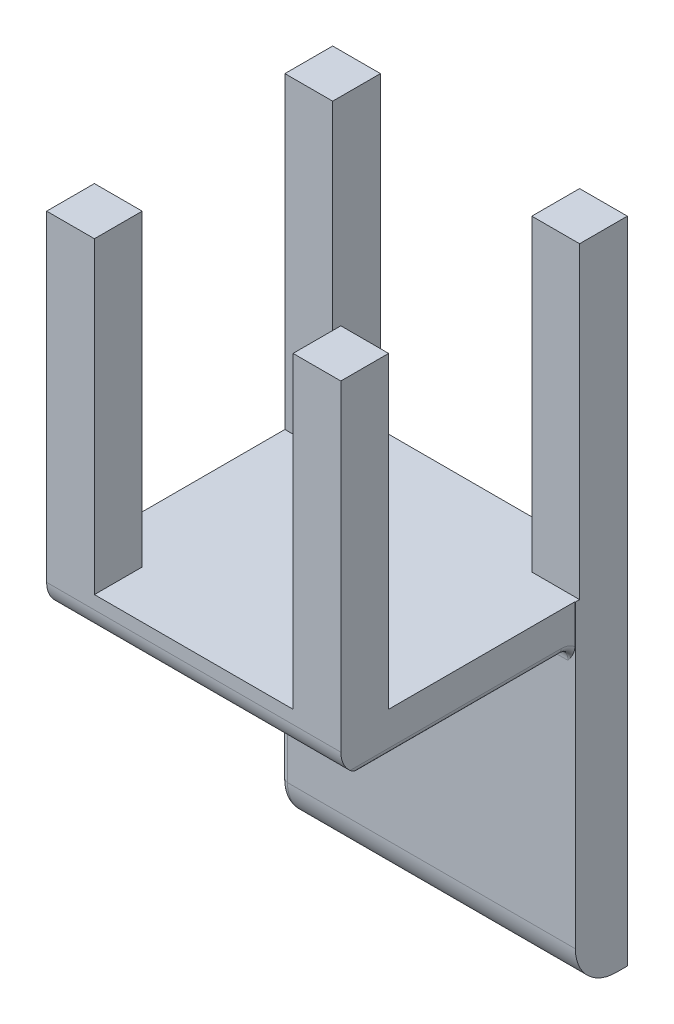
ISO-10303-21;
HEADER;
FILE_DESCRIPTION(('STEP AP214'),'2;1');
FILE_NAME('part.step','',(''),(''),'','','');
FILE_SCHEMA(('AUTOMOTIVE_DESIGN { 1 0 10303 214 1 1 1 1 }'));
ENDSEC;
DATA;
#1=APPLICATION_CONTEXT('core data for automotive mechanical design processes');
#2=APPLICATION_PROTOCOL_DEFINITION('international standard','automotive_design',2000,#1);
#3=PRODUCT_CONTEXT('',#1,'mechanical');
#4=PRODUCT('Part','Part','',(#3));
#5=PRODUCT_RELATED_PRODUCT_CATEGORY('part','',(#4));
#6=PRODUCT_DEFINITION_FORMATION('','',#4);
#7=PRODUCT_DEFINITION_CONTEXT('part definition',#1,'design');
#8=PRODUCT_DEFINITION('design','',#6,#7);
#9=PRODUCT_DEFINITION_SHAPE('','',#8);
#10=(LENGTH_UNIT() NAMED_UNIT(*) SI_UNIT(.MILLI.,.METRE.));
#11=(NAMED_UNIT(*) PLANE_ANGLE_UNIT() SI_UNIT($,.RADIAN.));
#12=(NAMED_UNIT(*) SI_UNIT($,.STERADIAN.) SOLID_ANGLE_UNIT());
#13=UNCERTAINTY_MEASURE_WITH_UNIT(LENGTH_MEASURE(1.E-05),#10,'distance_accuracy_value','');
#14=(GEOMETRIC_REPRESENTATION_CONTEXT(3) GLOBAL_UNCERTAINTY_ASSIGNED_CONTEXT((#13)) GLOBAL_UNIT_ASSIGNED_CONTEXT((#10,
#11,#12)) REPRESENTATION_CONTEXT('',''));
#15=CARTESIAN_POINT('',(0.,0.,0.));
#16=DIRECTION('',(0.,0.,1.));
#17=DIRECTION('',(1.,0.,0.));
#18=AXIS2_PLACEMENT_3D('',#15,#16,#17);
#19=CARTESIAN_POINT('',(-36.936387434555,59.4273560209424,-76.2));
#20=DIRECTION('',(0.,1.,0.));
#21=DIRECTION('',(0.,0.,1.));
#22=AXIS2_PLACEMENT_3D('',#19,#20,#21);
#23=PLANE('',#22);
#24=DIRECTION('',(0.,0.,-1.));
#25=VECTOR('',#24,1.);
#26=CARTESIAN_POINT('',(33.063612565445,59.4273560209424,-76.2));
#27=LINE('',#26,#25);
#28=CARTESIAN_POINT('',(33.063612565445,59.4273560209424,-6.20000000000001));
#29=VERTEX_POINT('',#28);
#30=CARTESIAN_POINT('',(33.063612565445,59.4273560209424,-76.2));
#31=VERTEX_POINT('',#30);
#32=EDGE_CURVE('E255',#29,#31,#27,.T.);
#33=ORIENTED_EDGE('',*,*,#32,.F.);
#34=DIRECTION('',(1.,0.,0.));
#35=VECTOR('',#34,1.);
#36=CARTESIAN_POINT('',(-36.936387434555,59.4273560209424,-6.2));
#37=LINE('',#36,#35);
#38=CARTESIAN_POINT('',(-36.936387434555,59.4273560209424,-6.20000000000003));
#39=VERTEX_POINT('',#38);
#40=EDGE_CURVE('E514',#39,#29,#37,.T.);
#41=ORIENTED_EDGE('',*,*,#40,.F.);
#42=DIRECTION('',(0.,0.,1.));
#43=VECTOR('',#42,1.);
#44=CARTESIAN_POINT('',(-36.936387434555,59.4273560209424,-76.2));
#45=LINE('',#44,#43);
#46=CARTESIAN_POINT('',(-36.936387434555,59.4273560209424,272.9));
#47=VERTEX_POINT('',#46);
#48=EDGE_CURVE('E260',#39,#47,#45,.T.);
#49=ORIENTED_EDGE('',*,*,#48,.T.);
#50=DIRECTION('',(-1.,0.,0.));
#51=VECTOR('',#50,1.);
#52=CARTESIAN_POINT('',(-36.9363874345549,59.4273560209424,272.9));
#53=LINE('',#52,#51);
#54=CARTESIAN_POINT('',(33.0636125654451,59.4273560209424,272.9));
#55=VERTEX_POINT('',#54);
#56=EDGE_CURVE('E320',#55,#47,#53,.T.);
#57=ORIENTED_EDGE('',*,*,#56,.F.);
#58=DIRECTION('',(0.,0.,-1.));
#59=VECTOR('',#58,1.);
#60=CARTESIAN_POINT('',(33.0636125654451,59.4273560209424,342.9));
#61=LINE('',#60,#59);
#62=CARTESIAN_POINT('',(33.0636125654451,59.4273560209424,342.9));
#63=VERTEX_POINT('',#62);
#64=EDGE_CURVE('E315',#63,#55,#61,.T.);
#65=ORIENTED_EDGE('',*,*,#64,.F.);
#66=DIRECTION('',(1.,0.,0.));
#67=VECTOR('',#66,1.);
#68=CARTESIAN_POINT('',(-36.9363874345549,59.4273560209424,342.9));
#69=LINE('',#68,#67);
#70=CARTESIAN_POINT('',(324.12168816682,59.4273560209424,342.9));
#71=VERTEX_POINT('',#70);
#72=EDGE_CURVE('E340',#63,#71,#69,.T.);
#73=ORIENTED_EDGE('',*,*,#72,.T.);
#74=DIRECTION('',(0.,0.,1.));
#75=VECTOR('',#74,1.);
#76=CARTESIAN_POINT('',(324.12168816682,59.4273560209424,342.9));
#77=LINE('',#76,#75);
#78=CARTESIAN_POINT('',(324.12168816682,59.4273560209424,272.9));
#79=VERTEX_POINT('',#78);
#80=EDGE_CURVE('E295',#79,#71,#77,.T.);
#81=ORIENTED_EDGE('',*,*,#80,.F.);
#82=DIRECTION('',(-1.,0.,0.));
#83=VECTOR('',#82,1.);
#84=CARTESIAN_POINT('',(394.12168816682,59.4273560209424,272.9));
#85=LINE('',#84,#83);
#86=CARTESIAN_POINT('',(394.12168816682,59.4273560209424,272.9));
#87=VERTEX_POINT('',#86);
#88=EDGE_CURVE('E290',#87,#79,#85,.T.);
#89=ORIENTED_EDGE('',*,*,#88,.F.);
#90=DIRECTION('',(0.,0.,-1.));
#91=VECTOR('',#90,1.);
#92=CARTESIAN_POINT('',(394.12168816682,59.4273560209424,-76.2));
#93=LINE('',#92,#91);
#94=CARTESIAN_POINT('',(394.12168816682,59.4273560209424,0.));
#95=VERTEX_POINT('',#94);
#96=EDGE_CURVE('E338',#87,#95,#93,.T.);
#97=ORIENTED_EDGE('',*,*,#96,.T.);
#98=DIRECTION('',(-1.,0.,0.));
#99=VECTOR('',#98,1.);
#100=CARTESIAN_POINT('',(-36.936387434555,59.4273560209424,0.));
#101=LINE('',#100,#99);
#102=CARTESIAN_POINT('',(394.863612565445,59.4273560209424,0.));
#103=VERTEX_POINT('',#102);
#104=EDGE_CURVE('E352',#103,#95,#101,.T.);
#105=ORIENTED_EDGE('',*,*,#104,.F.);
#106=DIRECTION('',(0.,0.,1.));
#107=VECTOR('',#106,1.);
#108=CARTESIAN_POINT('',(394.863612565445,59.4273560209424,-76.2));
#109=LINE('',#108,#107);
#110=CARTESIAN_POINT('',(394.863612565445,59.4273560209424,-6.20000000000003));
#111=VERTEX_POINT('',#110);
#112=EDGE_CURVE('E364',#111,#103,#109,.T.);
#113=ORIENTED_EDGE('',*,*,#112,.F.);
#114=DIRECTION('',(1.,0.,0.));
#115=VECTOR('',#114,1.);
#116=CARTESIAN_POINT('',(394.863612565445,59.4273560209424,-6.2));
#117=LINE('',#116,#115);
#118=CARTESIAN_POINT('',(324.863612565445,59.4273560209424,-6.2));
#119=VERTEX_POINT('',#118);
#120=EDGE_CURVE('E264',#119,#111,#117,.T.);
#121=ORIENTED_EDGE('',*,*,#120,.F.);
#122=DIRECTION('',(0.,0.,1.));
#123=VECTOR('',#122,1.);
#124=CARTESIAN_POINT('',(324.863612565445,59.4273560209424,-76.2));
#125=LINE('',#124,#123);
#126=CARTESIAN_POINT('',(324.863612565445,59.4273560209424,-76.2));
#127=VERTEX_POINT('',#126);
#128=EDGE_CURVE('E261',#127,#119,#125,.T.);
#129=ORIENTED_EDGE('',*,*,#128,.F.);
#130=DIRECTION('',(-1.,0.,0.));
#131=VECTOR('',#130,1.);
#132=CARTESIAN_POINT('',(-36.936387434555,59.4273560209424,-76.2));
#133=LINE('',#132,#131);
#134=EDGE_CURVE('E356',#127,#31,#133,.T.);
#135=ORIENTED_EDGE('',*,*,#134,.T.);
#136=EDGE_LOOP('',(#33,#41,#49,#57,#65,#73,#81,#89,#97,#105,#113,#121,#129,#135));
#137=FACE_BOUND('',#136,.T.);
#138=ADVANCED_FACE('F58',(#137),#23,.T.);
#139=CARTESIAN_POINT('',(-36.9363874345549,-440.572643979058,0.));
#140=DIRECTION('',(0.,0.,1.));
#141=DIRECTION('',(1.,0.,0.));
#142=AXIS2_PLACEMENT_3D('',#139,#140,#141);
#143=PLANE('',#142);
#144=DIRECTION('',(-1.,0.,0.));
#145=VECTOR('',#144,1.);
#146=CARTESIAN_POINT('',(-36.9363874345549,-20.,0.));
#147=LINE('',#146,#145);
#148=CARTESIAN_POINT('',(384.12168816682,-20.,0.));
#149=VERTEX_POINT('',#148);
#150=CARTESIAN_POINT('',(-26.936387434555,-20.,0.));
#151=VERTEX_POINT('',#150);
#152=EDGE_CURVE('E378',#149,#151,#147,.T.);
#153=ORIENTED_EDGE('',*,*,#152,.T.);
#154=DIRECTION('',(0.,-1.,0.));
#155=VECTOR('',#154,1.);
#156=CARTESIAN_POINT('',(-26.9363874345549,-440.572643979058,0.));
#157=LINE('',#156,#155);
#158=CARTESIAN_POINT('',(-26.9363874345549,-380.572643979058,0.));
#159=VERTEX_POINT('',#158);
#160=EDGE_CURVE('E459',#151,#159,#157,.T.);
#161=ORIENTED_EDGE('',*,*,#160,.T.);
#162=DIRECTION('',(1.,0.,0.));
#163=VECTOR('',#162,1.);
#164=CARTESIAN_POINT('',(-36.9363874345549,-380.572643979058,0.));
#165=LINE('',#164,#163);
#166=CARTESIAN_POINT('',(394.863612565445,-380.572643979058,0.));
#167=VERTEX_POINT('',#166);
#168=EDGE_CURVE('E371',#159,#167,#165,.T.);
#169=ORIENTED_EDGE('',*,*,#168,.T.);
#170=DIRECTION('',(0.,1.,0.));
#171=VECTOR('',#170,1.);
#172=CARTESIAN_POINT('',(394.863612565445,59.4273560209424,0.));
#173=LINE('',#172,#171);
#174=EDGE_CURVE('E348',#167,#103,#173,.T.);
#175=ORIENTED_EDGE('',*,*,#174,.T.);
#176=ORIENTED_EDGE('',*,*,#104,.T.);
#177=DIRECTION('',(0.,-1.,0.));
#178=VECTOR('',#177,1.);
#179=CARTESIAN_POINT('',(394.12168816682,-440.572643979058,0.));
#180=LINE('',#179,#178);
#181=CARTESIAN_POINT('',(394.12168816682,2.36067977499788,0.));
#182=VERTEX_POINT('',#181);
#183=EDGE_CURVE('E363',#95,#182,#180,.T.);
#184=ORIENTED_EDGE('',*,*,#183,.T.);
#185=CARTESIAN_POINT('',(394.12168816682,2.36067977499787,0.));
#186=CARTESIAN_POINT('',(394.121655533778,1.7668018034508,0.));
#187=CARTESIAN_POINT('',(394.092316176492,1.17350545199401,0.));
#188=CARTESIAN_POINT('',(393.981244959188,-0.00705360978580998,0.));
#189=CARTESIAN_POINT('',(393.899617732876,-0.594325995462053,0.));
#190=CARTESIAN_POINT('',(393.691865961787,-1.75077305326588,0.));
#191=CARTESIAN_POINT('',(393.566495634174,-2.32008651156857,0.));
#192=CARTESIAN_POINT('',(393.276405153814,-3.4487804276718,0.));
#193=CARTESIAN_POINT('',(393.111662985589,-4.00815513936166,0.));
#194=CARTESIAN_POINT('',(392.531699563841,-5.77388771393059,0.));
#195=CARTESIAN_POINT('',(392.051462169276,-6.95917298785604,0.));
#196=CARTESIAN_POINT('',(391.243384451654,-8.69510351090225,0.));
#197=CARTESIAN_POINT('',(390.9591135233,-9.26723662406322,0.));
#198=CARTESIAN_POINT('',(390.366142403757,-10.3987394378843,0.));
#199=CARTESIAN_POINT('',(390.057444523513,-10.9581103394957,0.));
#200=CARTESIAN_POINT('',(389.09608206183,-12.6288832158288,0.));
#201=CARTESIAN_POINT('',(388.413095174206,-13.7227184872839,0.));
#202=CARTESIAN_POINT('',(387.000753715579,-15.8784951602481,0.));
#203=CARTESIAN_POINT('',(386.271420170998,-16.9404507074046,0.));
#204=CARTESIAN_POINT('',(385.070518799888,-18.6580603080427,0.));
#205=CARTESIAN_POINT('',(384.604290340854,-19.3174964157779,0.));
#206=CARTESIAN_POINT('',(384.132574788428,-19.9846039925884,0.));
#207=CARTESIAN_POINT('',(384.127131477892,-19.9923019961752,0.));
#208=CARTESIAN_POINT('',(384.12168816682,-20.,0.));
#209=B_SPLINE_CURVE_WITH_KNOTS('',3,(#185,#186,#187,#188,#189,#190,#191,#192,#193,#194,#195,
#196,#197,#198,#199,#200,#201,#202,#203,#204,#205,#206,#207,#208),.UNSPECIFIED.,.F.,.F.,(4,2,2,
2,2,2,2,2,2,2,2,4),(0.,1.78007201554753,3.5565929945062,5.3038846405867,7.05215561193782,
10.8779322078743,12.7942256891127,14.7103380930115,18.5765462026267,22.4410126539084,
24.8638369819083,24.8921212531558),.UNSPECIFIED.);
#210=EDGE_CURVE('E393',#182,#149,#209,.T.);
#211=ORIENTED_EDGE('',*,*,#210,.T.);
#212=EDGE_LOOP('',(#153,#161,#169,#175,#176,#184,#211));
#213=FACE_BOUND('',#212,.T.);
#214=ADVANCED_FACE('F408',(#213),#143,.T.);
#215=CARTESIAN_POINT('',(-36.936387434555,59.4273560209424,-76.2));
#216=DIRECTION('',(-1.,0.,0.));
#217=DIRECTION('',(0.,-1.,0.));
#218=AXIS2_PLACEMENT_3D('',#215,#216,#217);
#219=PLANE('',#218);
#220=DIRECTION('',(0.,0.,1.));
#221=VECTOR('',#220,1.);
#222=CARTESIAN_POINT('',(-36.936387434555,9.99999999999999,342.9));
#223=LINE('',#222,#221);
#224=CARTESIAN_POINT('',(-36.936387434555,9.99999999999999,20.));
#225=VERTEX_POINT('',#224);
#226=CARTESIAN_POINT('',(-36.936387434555,10.,329.357513110646));
#227=VERTEX_POINT('',#226);
#228=EDGE_CURVE('E401',#225,#227,#223,.T.);
#229=ORIENTED_EDGE('',*,*,#228,.T.);
#230=CARTESIAN_POINT('',(-36.936387434555,40.,302.9));
#231=DIRECTION('',(-1.,0.,0.));
#232=DIRECTION('',(0.,-1.,0.));
#233=AXIS2_PLACEMENT_3D('',#230,#231,#232);
#234=CIRCLE('',#233,40.);
#235=CARTESIAN_POINT('',(-36.9363874345549,40.,342.9));
#236=VERTEX_POINT('',#235);
#237=EDGE_CURVE('E12',#227,#236,#234,.T.);
#238=ORIENTED_EDGE('',*,*,#237,.T.);
#239=DIRECTION('',(0.,-1.,0.));
#240=VECTOR('',#239,1.);
#241=CARTESIAN_POINT('',(-36.9363874345549,59.4273560209424,342.9));
#242=LINE('',#241,#240);
#243=CARTESIAN_POINT('',(-36.9363874345549,511.027356020943,342.9));
#244=VERTEX_POINT('',#243);
#245=EDGE_CURVE('E345',#244,#236,#242,.T.);
#246=ORIENTED_EDGE('',*,*,#245,.F.);
#247=DIRECTION('',(0.,0.,1.));
#248=VECTOR('',#247,1.);
#249=CARTESIAN_POINT('',(-36.9363874345549,511.027356020943,342.9));
#250=LINE('',#249,#248);
#251=CARTESIAN_POINT('',(-36.9363874345549,511.027356020943,272.9));
#252=VERTEX_POINT('',#251);
#253=EDGE_CURVE('E316',#252,#244,#250,.T.);
#254=ORIENTED_EDGE('',*,*,#253,.F.);
#255=DIRECTION('',(0.,-1.,0.));
#256=VECTOR('',#255,1.);
#257=CARTESIAN_POINT('',(-36.9363874345549,511.027356020943,272.9));
#258=LINE('',#257,#256);
#259=EDGE_CURVE('E326',#252,#47,#258,.T.);
#260=ORIENTED_EDGE('',*,*,#259,.T.);
#261=ORIENTED_EDGE('',*,*,#48,.F.);
#262=DIRECTION('',(0.,-1.,0.));
#263=VECTOR('',#262,1.);
#264=CARTESIAN_POINT('',(-36.936387434555,511.027356020943,-6.2));
#265=LINE('',#264,#263);
#266=CARTESIAN_POINT('',(-36.936387434555,511.027356020943,-6.2));
#267=VERTEX_POINT('',#266);
#268=EDGE_CURVE('E240',#267,#39,#265,.T.);
#269=ORIENTED_EDGE('',*,*,#268,.F.);
#270=DIRECTION('',(0.,0.,1.));
#271=VECTOR('',#270,1.);
#272=CARTESIAN_POINT('',(-36.936387434555,511.027356020943,-76.2));
#273=LINE('',#272,#271);
#274=CARTESIAN_POINT('',(-36.936387434555,511.027356020943,-76.2));
#275=VERTEX_POINT('',#274);
#276=EDGE_CURVE('E246',#275,#267,#273,.T.);
#277=ORIENTED_EDGE('',*,*,#276,.F.);
#278=DIRECTION('',(0.,-1.,0.));
#279=VECTOR('',#278,1.);
#280=CARTESIAN_POINT('',(-36.936387434555,59.4273560209424,-76.2));
#281=LINE('',#280,#279);
#282=CARTESIAN_POINT('',(-36.9363874345549,-430.572643979058,-76.2));
#283=VERTEX_POINT('',#282);
#284=EDGE_CURVE('E349',#275,#283,#281,.T.);
#285=ORIENTED_EDGE('',*,*,#284,.T.);
#286=DIRECTION('',(0.,0.,1.));
#287=VECTOR('',#286,1.);
#288=CARTESIAN_POINT('',(-36.9363874345549,-430.572643979058,-76.2));
#289=LINE('',#288,#287);
#290=CARTESIAN_POINT('',(-36.9363874345549,-430.572643979058,-60.));
#291=VERTEX_POINT('',#290);
#292=EDGE_CURVE('E530',#283,#291,#289,.T.);
#293=ORIENTED_EDGE('',*,*,#292,.T.);
#294=CARTESIAN_POINT('',(-36.9363874345549,-380.572643979058,-60.));
#295=DIRECTION('',(-1.,0.,0.));
#296=DIRECTION('',(0.,-1.,0.));
#297=AXIS2_PLACEMENT_3D('',#294,#295,#296);
#298=CIRCLE('',#297,50.);
#299=CARTESIAN_POINT('',(-36.9363874345549,-380.572643979058,-10.));
#300=VERTEX_POINT('',#299);
#301=EDGE_CURVE('E535',#291,#300,#298,.T.);
#302=ORIENTED_EDGE('',*,*,#301,.T.);
#303=DIRECTION('',(0.,-1.,0.));
#304=VECTOR('',#303,1.);
#305=CARTESIAN_POINT('',(-36.936387434555,59.4273560209424,-9.99999999999999));
#306=LINE('',#305,#304);
#307=CARTESIAN_POINT('',(-36.936387434555,-20.,-10.));
#308=VERTEX_POINT('',#307);
#309=EDGE_CURVE('E538',#300,#308,#306,.F.);
#310=ORIENTED_EDGE('',*,*,#309,.T.);
#311=CARTESIAN_POINT('',(-36.936387434555,-20.,20.));
#312=DIRECTION('',(-1.,0.,0.));
#313=DIRECTION('',(0.,-1.,0.));
#314=AXIS2_PLACEMENT_3D('',#311,#312,#313);
#315=CIRCLE('',#314,30.);
#316=EDGE_CURVE('E549',#308,#225,#315,.F.);
#317=ORIENTED_EDGE('',*,*,#316,.T.);
#318=EDGE_LOOP('',(#229,#238,#246,#254,#260,#261,#269,#277,#285,#293,#302,#310,#317));
#319=FACE_BOUND('',#318,.T.);
#320=ADVANCED_FACE('F258',(#319),#219,.T.);
#321=CARTESIAN_POINT('',(394.863612565445,59.4273560209424,-76.2));
#322=DIRECTION('',(1.,0.,0.));
#323=DIRECTION('',(0.,1.,0.));
#324=AXIS2_PLACEMENT_3D('',#321,#322,#323);
#325=PLANE('',#324);
#326=ORIENTED_EDGE('',*,*,#174,.F.);
#327=CARTESIAN_POINT('',(394.863612565445,-380.572643979058,-60.));
#328=DIRECTION('',(1.,0.,0.));
#329=DIRECTION('',(0.,1.,0.));
#330=AXIS2_PLACEMENT_3D('',#327,#328,#329);
#331=CIRCLE('',#330,60.);
#332=CARTESIAN_POINT('',(394.863612565445,-440.572643979058,-60.));
#333=VERTEX_POINT('',#332);
#334=EDGE_CURVE('E373',#167,#333,#331,.T.);
#335=ORIENTED_EDGE('',*,*,#334,.T.);
#336=DIRECTION('',(0.,0.,1.));
#337=VECTOR('',#336,1.);
#338=CARTESIAN_POINT('',(394.863612565445,-440.572643979058,-76.2));
#339=LINE('',#338,#337);
#340=CARTESIAN_POINT('',(394.863612565445,-440.572643979058,-76.2));
#341=VERTEX_POINT('',#340);
#342=EDGE_CURVE('E358',#341,#333,#339,.T.);
#343=ORIENTED_EDGE('',*,*,#342,.F.);
#344=DIRECTION('',(0.,1.,0.));
#345=VECTOR('',#344,1.);
#346=CARTESIAN_POINT('',(394.863612565445,59.4273560209424,-76.2));
#347=LINE('',#346,#345);
#348=CARTESIAN_POINT('',(394.863612565445,511.027356020943,-76.2));
#349=VERTEX_POINT('',#348);
#350=EDGE_CURVE('E354',#341,#349,#347,.T.);
#351=ORIENTED_EDGE('',*,*,#350,.T.);
#352=DIRECTION('',(0.,0.,-1.));
#353=VECTOR('',#352,1.);
#354=CARTESIAN_POINT('',(394.863612565445,511.027356020943,-76.2));
#355=LINE('',#354,#353);
#356=CARTESIAN_POINT('',(394.863612565445,511.027356020943,-6.2));
#357=VERTEX_POINT('',#356);
#358=EDGE_CURVE('E270',#357,#349,#355,.T.);
#359=ORIENTED_EDGE('',*,*,#358,.F.);
#360=DIRECTION('',(0.,-1.,0.));
#361=VECTOR('',#360,1.);
#362=CARTESIAN_POINT('',(394.863612565445,511.027356020943,-6.2));
#363=LINE('',#362,#361);
#364=EDGE_CURVE('E278',#357,#111,#363,.T.);
#365=ORIENTED_EDGE('',*,*,#364,.T.);
#366=ORIENTED_EDGE('',*,*,#112,.T.);
#367=EDGE_LOOP('',(#326,#335,#343,#351,#359,#365,#366));
#368=FACE_BOUND('',#367,.T.);
#369=ADVANCED_FACE('F419',(#368),#325,.T.);
#370=CARTESIAN_POINT('',(-36.9363874345549,-440.572643979058,-76.2));
#371=DIRECTION('',(0.,-1.,0.));
#372=DIRECTION('',(0.,0.,-1.));
#373=AXIS2_PLACEMENT_3D('',#370,#371,#372);
#374=PLANE('',#373);
#375=DIRECTION('',(1.,0.,0.));
#376=VECTOR('',#375,1.);
#377=CARTESIAN_POINT('',(-36.9363874345549,-440.572643979058,-60.));
#378=LINE('',#377,#376);
#379=CARTESIAN_POINT('',(-26.9363874345549,-440.572643979058,-60.));
#380=VERTEX_POINT('',#379);
#381=EDGE_CURVE('E375',#333,#380,#378,.F.);
#382=ORIENTED_EDGE('',*,*,#381,.T.);
#383=DIRECTION('',(0.,0.,1.));
#384=VECTOR('',#383,1.);
#385=CARTESIAN_POINT('',(-26.9363874345549,-440.572643979058,-76.2));
#386=LINE('',#385,#384);
#387=CARTESIAN_POINT('',(-26.9363874345549,-440.572643979058,-76.2));
#388=VERTEX_POINT('',#387);
#389=EDGE_CURVE('E534',#380,#388,#386,.F.);
#390=ORIENTED_EDGE('',*,*,#389,.T.);
#391=DIRECTION('',(1.,0.,0.));
#392=VECTOR('',#391,1.);
#393=CARTESIAN_POINT('',(-36.9363874345549,-440.572643979058,-76.2));
#394=LINE('',#393,#392);
#395=EDGE_CURVE('E351',#388,#341,#394,.T.);
#396=ORIENTED_EDGE('',*,*,#395,.T.);
#397=ORIENTED_EDGE('',*,*,#342,.T.);
#398=EDGE_LOOP('',(#382,#390,#396,#397));
#399=FACE_BOUND('',#398,.T.);
#400=ADVANCED_FACE('F422',(#399),#374,.T.);
#401=CARTESIAN_POINT('',(-36.9363874345549,-440.572643979058,-76.2));
#402=DIRECTION('',(0.,0.,1.));
#403=DIRECTION('',(1.,0.,0.));
#404=AXIS2_PLACEMENT_3D('',#401,#402,#403);
#405=PLANE('',#404);
#406=ORIENTED_EDGE('',*,*,#395,.F.);
#407=CARTESIAN_POINT('',(-26.9363874345549,-430.572643979058,-76.2));
#408=DIRECTION('',(0.,0.,1.));
#409=DIRECTION('',(1.,0.,0.));
#410=AXIS2_PLACEMENT_3D('',#407,#408,#409);
#411=CIRCLE('',#410,10.);
#412=EDGE_CURVE('E527',#388,#283,#411,.F.);
#413=ORIENTED_EDGE('',*,*,#412,.T.);
#414=ORIENTED_EDGE('',*,*,#284,.F.);
#415=DIRECTION('',(-1.,0.,0.));
#416=VECTOR('',#415,1.);
#417=CARTESIAN_POINT('',(-36.936387434555,511.027356020943,-76.2));
#418=LINE('',#417,#416);
#419=CARTESIAN_POINT('',(33.063612565445,511.027356020943,-76.2));
#420=VERTEX_POINT('',#419);
#421=EDGE_CURVE('E252',#420,#275,#418,.T.);
#422=ORIENTED_EDGE('',*,*,#421,.F.);
#423=DIRECTION('',(0.,-1.,0.));
#424=VECTOR('',#423,1.);
#425=CARTESIAN_POINT('',(33.063612565445,511.027356020943,-76.2));
#426=LINE('',#425,#424);
#427=EDGE_CURVE('E266',#420,#31,#426,.T.);
#428=ORIENTED_EDGE('',*,*,#427,.T.);
#429=ORIENTED_EDGE('',*,*,#134,.F.);
#430=DIRECTION('',(0.,-1.,0.));
#431=VECTOR('',#430,1.);
#432=CARTESIAN_POINT('',(324.863612565445,511.027356020943,-76.2));
#433=LINE('',#432,#431);
#434=CARTESIAN_POINT('',(324.863612565445,511.027356020943,-76.2));
#435=VERTEX_POINT('',#434);
#436=EDGE_CURVE('E287',#435,#127,#433,.T.);
#437=ORIENTED_EDGE('',*,*,#436,.F.);
#438=DIRECTION('',(-1.,0.,0.));
#439=VECTOR('',#438,1.);
#440=CARTESIAN_POINT('',(394.863612565445,511.027356020943,-76.2));
#441=LINE('',#440,#439);
#442=EDGE_CURVE('E273',#349,#435,#441,.T.);
#443=ORIENTED_EDGE('',*,*,#442,.F.);
#444=ORIENTED_EDGE('',*,*,#350,.F.);
#445=EDGE_LOOP('',(#406,#413,#414,#422,#428,#429,#437,#443,#444));
#446=FACE_BOUND('',#445,.T.);
#447=ADVANCED_FACE('F414',(#446),#405,.F.);
#448=CARTESIAN_POINT('',(394.12168816682,59.4273560209424,-76.2));
#449=DIRECTION('',(-1.,0.,0.));
#450=DIRECTION('',(0.,0.,1.));
#451=AXIS2_PLACEMENT_3D('',#448,#449,#450);
#452=PLANE('',#451);
#453=DIRECTION('',(0.,-1.,0.));
#454=VECTOR('',#453,1.);
#455=CARTESIAN_POINT('',(394.12168816682,59.4273560209424,342.9));
#456=LINE('',#455,#454);
#457=CARTESIAN_POINT('',(394.12168816682,511.027356020943,342.9));
#458=VERTEX_POINT('',#457);
#459=CARTESIAN_POINT('',(394.12168816682,40.,342.9));
#460=VERTEX_POINT('',#459);
#461=EDGE_CURVE('E342',#458,#460,#456,.T.);
#462=ORIENTED_EDGE('',*,*,#461,.T.);
#463=CARTESIAN_POINT('',(394.12168816682,40.,302.9));
#464=DIRECTION('',(-1.,0.,0.));
#465=DIRECTION('',(0.,0.,1.));
#466=AXIS2_PLACEMENT_3D('',#463,#464,#465);
#467=CIRCLE('',#466,40.);
#468=CARTESIAN_POINT('',(394.12168816682,9.99999999999999,329.357513110646));
#469=VERTEX_POINT('',#468);
#470=EDGE_CURVE('E475',#460,#469,#467,.F.);
#471=ORIENTED_EDGE('',*,*,#470,.T.);
#472=DIRECTION('',(0.,0.,-1.));
#473=VECTOR('',#472,1.);
#474=CARTESIAN_POINT('',(394.12168816682,9.99999999999999,-76.2));
#475=LINE('',#474,#473);
#476=CARTESIAN_POINT('',(394.12168816682,9.99999999999999,20.));
#477=VERTEX_POINT('',#476);
#478=EDGE_CURVE('E383',#469,#477,#475,.T.);
#479=ORIENTED_EDGE('',*,*,#478,.T.);
#480=CARTESIAN_POINT('',(394.12168816682,-20.,20.));
#481=DIRECTION('',(-1.,0.,0.));
#482=DIRECTION('',(0.,0.,1.));
#483=AXIS2_PLACEMENT_3D('',#480,#481,#482);
#484=CIRCLE('',#483,30.);
#485=EDGE_CURVE('E385',#477,#182,#484,.T.);
#486=ORIENTED_EDGE('',*,*,#485,.T.);
#487=ORIENTED_EDGE('',*,*,#183,.F.);
#488=ORIENTED_EDGE('',*,*,#96,.F.);
#489=DIRECTION('',(0.,-1.,0.));
#490=VECTOR('',#489,1.);
#491=CARTESIAN_POINT('',(394.12168816682,511.027356020943,272.9));
#492=LINE('',#491,#490);
#493=CARTESIAN_POINT('',(394.12168816682,511.027356020943,272.9));
#494=VERTEX_POINT('',#493);
#495=EDGE_CURVE('E312',#494,#87,#492,.T.);
#496=ORIENTED_EDGE('',*,*,#495,.F.);
#497=DIRECTION('',(0.,0.,-1.));
#498=VECTOR('',#497,1.);
#499=CARTESIAN_POINT('',(394.12168816682,511.027356020943,342.9));
#500=LINE('',#499,#498);
#501=EDGE_CURVE('E291',#458,#494,#500,.T.);
#502=ORIENTED_EDGE('',*,*,#501,.F.);
#503=EDGE_LOOP('',(#462,#471,#479,#486,#487,#488,#496,#502));
#504=FACE_BOUND('',#503,.T.);
#505=ADVANCED_FACE('F561',(#504),#452,.F.);
#506=CARTESIAN_POINT('',(-36.9363874345549,59.4273560209424,342.9));
#507=DIRECTION('',(0.,0.,-1.));
#508=DIRECTION('',(-1.,0.,0.));
#509=AXIS2_PLACEMENT_3D('',#506,#507,#508);
#510=PLANE('',#509);
#511=ORIENTED_EDGE('',*,*,#245,.T.);
#512=DIRECTION('',(1.,0.,0.));
#513=VECTOR('',#512,1.);
#514=CARTESIAN_POINT('',(-36.9363874345549,40.,342.9));
#515=LINE('',#514,#513);
#516=EDGE_CURVE('E461',#236,#460,#515,.T.);
#517=ORIENTED_EDGE('',*,*,#516,.T.);
#518=ORIENTED_EDGE('',*,*,#461,.F.);
#519=DIRECTION('',(1.,0.,0.));
#520=VECTOR('',#519,1.);
#521=CARTESIAN_POINT('',(394.12168816682,511.027356020943,342.9));
#522=LINE('',#521,#520);
#523=CARTESIAN_POINT('',(324.12168816682,511.027356020943,342.9));
#524=VERTEX_POINT('',#523);
#525=EDGE_CURVE('E299',#524,#458,#522,.T.);
#526=ORIENTED_EDGE('',*,*,#525,.F.);
#527=DIRECTION('',(0.,-1.,0.));
#528=VECTOR('',#527,1.);
#529=CARTESIAN_POINT('',(324.12168816682,511.027356020943,342.9));
#530=LINE('',#529,#528);
#531=EDGE_CURVE('E302',#524,#71,#530,.T.);
#532=ORIENTED_EDGE('',*,*,#531,.T.);
#533=ORIENTED_EDGE('',*,*,#72,.F.);
#534=DIRECTION('',(0.,-1.,0.));
#535=VECTOR('',#534,1.);
#536=CARTESIAN_POINT('',(33.0636125654451,511.027356020943,342.9));
#537=LINE('',#536,#535);
#538=CARTESIAN_POINT('',(33.0636125654451,511.027356020943,342.9));
#539=VERTEX_POINT('',#538);
#540=EDGE_CURVE('E335',#539,#63,#537,.T.);
#541=ORIENTED_EDGE('',*,*,#540,.F.);
#542=DIRECTION('',(1.,0.,0.));
#543=VECTOR('',#542,1.);
#544=CARTESIAN_POINT('',(-36.9363874345549,511.027356020943,342.9));
#545=LINE('',#544,#543);
#546=EDGE_CURVE('E319',#244,#539,#545,.T.);
#547=ORIENTED_EDGE('',*,*,#546,.F.);
#548=EDGE_LOOP('',(#511,#517,#518,#526,#532,#533,#541,#547));
#549=FACE_BOUND('',#548,.T.);
#550=ADVANCED_FACE('F556',(#549),#510,.F.);
#551=CARTESIAN_POINT('',(394.12168816682,0.,342.9));
#552=DIRECTION('',(0.,1.,0.));
#553=DIRECTION('',(0.,0.,1.));
#554=AXIS2_PLACEMENT_3D('',#551,#552,#553);
#555=PLANE('',#554);
#556=DIRECTION('',(0.,0.,-1.));
#557=VECTOR('',#556,1.);
#558=CARTESIAN_POINT('',(384.12168816682,0.,342.9));
#559=LINE('',#558,#557);
#560=CARTESIAN_POINT('',(384.12168816682,0.,20.));
#561=VERTEX_POINT('',#560);
#562=CARTESIAN_POINT('',(384.12168816682,0.,302.9));
#563=VERTEX_POINT('',#562);
#564=EDGE_CURVE('E391',#561,#563,#559,.F.);
#565=ORIENTED_EDGE('',*,*,#564,.T.);
#566=DIRECTION('',(1.,0.,0.));
#567=VECTOR('',#566,1.);
#568=CARTESIAN_POINT('',(394.12168816682,0.,302.9));
#569=LINE('',#568,#567);
#570=CARTESIAN_POINT('',(-26.936387434555,0.,302.9));
#571=VERTEX_POINT('',#570);
#572=EDGE_CURVE('E81',#563,#571,#569,.F.);
#573=ORIENTED_EDGE('',*,*,#572,.T.);
#574=DIRECTION('',(0.,0.,1.));
#575=VECTOR('',#574,1.);
#576=CARTESIAN_POINT('',(-26.936387434555,0.,20.));
#577=LINE('',#576,#575);
#578=CARTESIAN_POINT('',(-26.936387434555,0.,20.));
#579=VERTEX_POINT('',#578);
#580=EDGE_CURVE('E450',#571,#579,#577,.F.);
#581=ORIENTED_EDGE('',*,*,#580,.T.);
#582=DIRECTION('',(-1.,0.,0.));
#583=VECTOR('',#582,1.);
#584=CARTESIAN_POINT('',(394.12168816682,0.,20.));
#585=LINE('',#584,#583);
#586=EDGE_CURVE('E381',#579,#561,#585,.F.);
#587=ORIENTED_EDGE('',*,*,#586,.T.);
#588=EDGE_LOOP('',(#565,#573,#581,#587));
#589=FACE_BOUND('',#588,.T.);
#590=ADVANCED_FACE('F594',(#589),#555,.F.);
#591=CARTESIAN_POINT('',(33.0636125654451,511.027356020943,342.9));
#592=DIRECTION('',(-1.,0.,0.));
#593=DIRECTION('',(0.,0.,1.));
#594=AXIS2_PLACEMENT_3D('',#591,#592,#593);
#595=PLANE('',#594);
#596=ORIENTED_EDGE('',*,*,#64,.T.);
#597=DIRECTION('',(0.,-1.,0.));
#598=VECTOR('',#597,1.);
#599=CARTESIAN_POINT('',(33.0636125654451,511.027356020943,272.9));
#600=LINE('',#599,#598);
#601=CARTESIAN_POINT('',(33.0636125654451,511.027356020943,272.9));
#602=VERTEX_POINT('',#601);
#603=EDGE_CURVE('E332',#602,#55,#600,.T.);
#604=ORIENTED_EDGE('',*,*,#603,.F.);
#605=DIRECTION('',(0.,0.,-1.));
#606=VECTOR('',#605,1.);
#607=CARTESIAN_POINT('',(33.0636125654451,511.027356020943,342.9));
#608=LINE('',#607,#606);
#609=EDGE_CURVE('E322',#539,#602,#608,.T.);
#610=ORIENTED_EDGE('',*,*,#609,.F.);
#611=ORIENTED_EDGE('',*,*,#540,.T.);
#612=EDGE_LOOP('',(#596,#604,#610,#611));
#613=FACE_BOUND('',#612,.T.);
#614=ADVANCED_FACE('F590',(#613),#595,.F.);
#615=CARTESIAN_POINT('',(-36.9363874345549,511.027356020943,272.9));
#616=DIRECTION('',(0.,0.,1.));
#617=DIRECTION('',(1.,0.,0.));
#618=AXIS2_PLACEMENT_3D('',#615,#616,#617);
#619=PLANE('',#618);
#620=ORIENTED_EDGE('',*,*,#56,.T.);
#621=ORIENTED_EDGE('',*,*,#259,.F.);
#622=DIRECTION('',(-1.,0.,0.));
#623=VECTOR('',#622,1.);
#624=CARTESIAN_POINT('',(-36.9363874345549,511.027356020943,272.9));
#625=LINE('',#624,#623);
#626=EDGE_CURVE('E324',#602,#252,#625,.T.);
#627=ORIENTED_EDGE('',*,*,#626,.F.);
#628=ORIENTED_EDGE('',*,*,#603,.T.);
#629=EDGE_LOOP('',(#620,#621,#627,#628));
#630=FACE_BOUND('',#629,.T.);
#631=ADVANCED_FACE('F583',(#630),#619,.F.);
#632=CARTESIAN_POINT('',(-36.9363874345549,511.027356020943,272.9));
#633=DIRECTION('',(0.,-1.,0.));
#634=DIRECTION('',(0.,0.,-1.));
#635=AXIS2_PLACEMENT_3D('',#632,#633,#634);
#636=PLANE('',#635);
#637=ORIENTED_EDGE('',*,*,#253,.T.);
#638=ORIENTED_EDGE('',*,*,#546,.T.);
#639=ORIENTED_EDGE('',*,*,#609,.T.);
#640=ORIENTED_EDGE('',*,*,#626,.T.);
#641=EDGE_LOOP('',(#637,#638,#639,#640));
#642=FACE_BOUND('',#641,.T.);
#643=ADVANCED_FACE('F576',(#642),#636,.F.);
#644=CARTESIAN_POINT('',(394.12168816682,511.027356020943,272.9));
#645=DIRECTION('',(0.,0.,1.));
#646=DIRECTION('',(1.,0.,0.));
#647=AXIS2_PLACEMENT_3D('',#644,#645,#646);
#648=PLANE('',#647);
#649=ORIENTED_EDGE('',*,*,#88,.T.);
#650=DIRECTION('',(0.,-1.,0.));
#651=VECTOR('',#650,1.);
#652=CARTESIAN_POINT('',(324.12168816682,511.027356020943,272.9));
#653=LINE('',#652,#651);
#654=CARTESIAN_POINT('',(324.12168816682,511.027356020943,272.9));
#655=VERTEX_POINT('',#654);
#656=EDGE_CURVE('E309',#655,#79,#653,.T.);
#657=ORIENTED_EDGE('',*,*,#656,.F.);
#658=DIRECTION('',(-1.,0.,0.));
#659=VECTOR('',#658,1.);
#660=CARTESIAN_POINT('',(394.12168816682,511.027356020943,272.9));
#661=LINE('',#660,#659);
#662=EDGE_CURVE('E294',#494,#655,#661,.T.);
#663=ORIENTED_EDGE('',*,*,#662,.F.);
#664=ORIENTED_EDGE('',*,*,#495,.T.);
#665=EDGE_LOOP('',(#649,#657,#663,#664));
#666=FACE_BOUND('',#665,.T.);
#667=ADVANCED_FACE('F574',(#666),#648,.F.);
#668=CARTESIAN_POINT('',(324.12168816682,511.027356020943,342.9));
#669=DIRECTION('',(1.,0.,0.));
#670=DIRECTION('',(0.,0.,-1.));
#671=AXIS2_PLACEMENT_3D('',#668,#669,#670);
#672=PLANE('',#671);
#673=ORIENTED_EDGE('',*,*,#80,.T.);
#674=ORIENTED_EDGE('',*,*,#531,.F.);
#675=DIRECTION('',(0.,0.,1.));
#676=VECTOR('',#675,1.);
#677=CARTESIAN_POINT('',(324.12168816682,511.027356020943,342.9));
#678=LINE('',#677,#676);
#679=EDGE_CURVE('E297',#655,#524,#678,.T.);
#680=ORIENTED_EDGE('',*,*,#679,.F.);
#681=ORIENTED_EDGE('',*,*,#656,.T.);
#682=EDGE_LOOP('',(#673,#674,#680,#681));
#683=FACE_BOUND('',#682,.T.);
#684=ADVANCED_FACE('F572',(#683),#672,.F.);
#685=CARTESIAN_POINT('',(394.12168816682,511.027356020943,272.9));
#686=DIRECTION('',(0.,1.,0.));
#687=DIRECTION('',(0.,0.,1.));
#688=AXIS2_PLACEMENT_3D('',#685,#686,#687);
#689=PLANE('',#688);
#690=ORIENTED_EDGE('',*,*,#501,.T.);
#691=ORIENTED_EDGE('',*,*,#662,.T.);
#692=ORIENTED_EDGE('',*,*,#679,.T.);
#693=ORIENTED_EDGE('',*,*,#525,.T.);
#694=EDGE_LOOP('',(#690,#691,#692,#693));
#695=FACE_BOUND('',#694,.T.);
#696=ADVANCED_FACE('F565',(#695),#689,.T.);
#697=CARTESIAN_POINT('',(324.863612565445,511.027356020943,-76.2));
#698=DIRECTION('',(1.,0.,0.));
#699=DIRECTION('',(0.,0.,-1.));
#700=AXIS2_PLACEMENT_3D('',#697,#698,#699);
#701=PLANE('',#700);
#702=ORIENTED_EDGE('',*,*,#128,.T.);
#703=DIRECTION('',(0.,-1.,0.));
#704=VECTOR('',#703,1.);
#705=CARTESIAN_POINT('',(324.863612565445,511.027356020943,-6.2));
#706=LINE('',#705,#704);
#707=CARTESIAN_POINT('',(324.863612565445,511.027356020943,-6.2));
#708=VERTEX_POINT('',#707);
#709=EDGE_CURVE('E284',#708,#119,#706,.T.);
#710=ORIENTED_EDGE('',*,*,#709,.F.);
#711=DIRECTION('',(0.,0.,1.));
#712=VECTOR('',#711,1.);
#713=CARTESIAN_POINT('',(324.863612565445,511.027356020943,-76.2));
#714=LINE('',#713,#712);
#715=EDGE_CURVE('E275',#435,#708,#714,.T.);
#716=ORIENTED_EDGE('',*,*,#715,.F.);
#717=ORIENTED_EDGE('',*,*,#436,.T.);
#718=EDGE_LOOP('',(#702,#710,#716,#717));
#719=FACE_BOUND('',#718,.T.);
#720=ADVANCED_FACE('F694',(#719),#701,.F.);
#721=CARTESIAN_POINT('',(394.863612565445,511.027356020943,-6.2));
#722=DIRECTION('',(0.,0.,-1.));
#723=DIRECTION('',(-1.,0.,0.));
#724=AXIS2_PLACEMENT_3D('',#721,#722,#723);
#725=PLANE('',#724);
#726=ORIENTED_EDGE('',*,*,#120,.T.);
#727=ORIENTED_EDGE('',*,*,#364,.F.);
#728=DIRECTION('',(1.,0.,0.));
#729=VECTOR('',#728,1.);
#730=CARTESIAN_POINT('',(394.863612565445,511.027356020943,-6.2));
#731=LINE('',#730,#729);
#732=EDGE_CURVE('E277',#708,#357,#731,.T.);
#733=ORIENTED_EDGE('',*,*,#732,.F.);
#734=ORIENTED_EDGE('',*,*,#709,.T.);
#735=EDGE_LOOP('',(#726,#727,#733,#734));
#736=FACE_BOUND('',#735,.T.);
#737=ADVANCED_FACE('F852',(#736),#725,.F.);
#738=CARTESIAN_POINT('',(394.863612565445,511.027356020943,-6.2));
#739=DIRECTION('',(0.,-1.,0.));
#740=DIRECTION('',(0.,0.,-1.));
#741=AXIS2_PLACEMENT_3D('',#738,#739,#740);
#742=PLANE('',#741);
#743=ORIENTED_EDGE('',*,*,#358,.T.);
#744=ORIENTED_EDGE('',*,*,#442,.T.);
#745=ORIENTED_EDGE('',*,*,#715,.T.);
#746=ORIENTED_EDGE('',*,*,#732,.T.);
#747=EDGE_LOOP('',(#743,#744,#745,#746));
#748=FACE_BOUND('',#747,.T.);
#749=ADVANCED_FACE('F863',(#748),#742,.F.);
#750=CARTESIAN_POINT('',(-36.936387434555,511.027356020943,-6.2));
#751=DIRECTION('',(0.,0.,-1.));
#752=DIRECTION('',(-1.,0.,0.));
#753=AXIS2_PLACEMENT_3D('',#750,#751,#752);
#754=PLANE('',#753);
#755=ORIENTED_EDGE('',*,*,#40,.T.);
#756=DIRECTION('',(0.,-1.,0.));
#757=VECTOR('',#756,1.);
#758=CARTESIAN_POINT('',(33.063612565445,511.027356020943,-6.20000000000001));
#759=LINE('',#758,#757);
#760=CARTESIAN_POINT('',(33.063612565445,511.027356020943,-6.20000000000001));
#761=VERTEX_POINT('',#760);
#762=EDGE_CURVE('E242',#761,#29,#759,.T.);
#763=ORIENTED_EDGE('',*,*,#762,.F.);
#764=DIRECTION('',(1.,0.,0.));
#765=VECTOR('',#764,1.);
#766=CARTESIAN_POINT('',(-36.936387434555,511.027356020943,-6.2));
#767=LINE('',#766,#765);
#768=EDGE_CURVE('E235',#267,#761,#767,.T.);
#769=ORIENTED_EDGE('',*,*,#768,.F.);
#770=ORIENTED_EDGE('',*,*,#268,.T.);
#771=EDGE_LOOP('',(#755,#763,#769,#770));
#772=FACE_BOUND('',#771,.T.);
#773=ADVANCED_FACE('F238',(#772),#754,.F.);
#774=CARTESIAN_POINT('',(33.063612565445,511.027356020943,-76.2));
#775=DIRECTION('',(-1.,0.,0.));
#776=DIRECTION('',(0.,0.,1.));
#777=AXIS2_PLACEMENT_3D('',#774,#775,#776);
#778=PLANE('',#777);
#779=ORIENTED_EDGE('',*,*,#32,.T.);
#780=ORIENTED_EDGE('',*,*,#427,.F.);
#781=DIRECTION('',(0.,0.,-1.));
#782=VECTOR('',#781,1.);
#783=CARTESIAN_POINT('',(33.063612565445,511.027356020943,-76.2));
#784=LINE('',#783,#782);
#785=EDGE_CURVE('E245',#761,#420,#784,.T.);
#786=ORIENTED_EDGE('',*,*,#785,.F.);
#787=ORIENTED_EDGE('',*,*,#762,.T.);
#788=EDGE_LOOP('',(#779,#780,#786,#787));
#789=FACE_BOUND('',#788,.T.);
#790=ADVANCED_FACE('F524',(#789),#778,.F.);
#791=CARTESIAN_POINT('',(-36.936387434555,511.027356020943,-6.2));
#792=DIRECTION('',(0.,1.,0.));
#793=DIRECTION('',(0.,0.,1.));
#794=AXIS2_PLACEMENT_3D('',#791,#792,#793);
#795=PLANE('',#794);
#796=ORIENTED_EDGE('',*,*,#276,.T.);
#797=ORIENTED_EDGE('',*,*,#768,.T.);
#798=ORIENTED_EDGE('',*,*,#785,.T.);
#799=ORIENTED_EDGE('',*,*,#421,.T.);
#800=EDGE_LOOP('',(#796,#797,#798,#799));
#801=FACE_BOUND('',#800,.T.);
#802=ADVANCED_FACE('F250',(#801),#795,.T.);
#803=CARTESIAN_POINT('',(-36.9363874345549,-380.572643979058,-60.));
#804=DIRECTION('',(1.,0.,0.));
#805=DIRECTION('',(0.,0.,-1.));
#806=AXIS2_PLACEMENT_3D('',#803,#804,#805);
#807=CYLINDRICAL_SURFACE('',#806,60.);
#808=ORIENTED_EDGE('',*,*,#168,.F.);
#809=CARTESIAN_POINT('',(-26.9363874345549,-380.572643979058,-60.));
#810=DIRECTION('',(-1.,0.,0.));
#811=DIRECTION('',(0.,-1.,0.));
#812=AXIS2_PLACEMENT_3D('',#809,#810,#811);
#813=CIRCLE('',#812,60.);
#814=EDGE_CURVE('E463',#159,#380,#813,.F.);
#815=ORIENTED_EDGE('',*,*,#814,.T.);
#816=ORIENTED_EDGE('',*,*,#381,.F.);
#817=ORIENTED_EDGE('',*,*,#334,.F.);
#818=EDGE_LOOP('',(#808,#815,#816,#817));
#819=FACE_BOUND('',#818,.T.);
#820=ADVANCED_FACE('F429',(#819),#807,.T.);
#821=CARTESIAN_POINT('',(-36.9363874345549,-20.,20.));
#822=DIRECTION('',(-1.,0.,0.));
#823=DIRECTION('',(0.,0.,1.));
#824=AXIS2_PLACEMENT_3D('',#821,#822,#823);
#825=CYLINDRICAL_SURFACE('',#824,20.);
#826=ORIENTED_EDGE('',*,*,#586,.F.);
#827=CARTESIAN_POINT('',(-26.936387434555,-20.,20.));
#828=DIRECTION('',(-1.,0.,0.));
#829=DIRECTION('',(0.,-1.,0.));
#830=AXIS2_PLACEMENT_3D('',#827,#828,#829);
#831=CIRCLE('',#830,20.);
#832=EDGE_CURVE('E444',#579,#151,#831,.T.);
#833=ORIENTED_EDGE('',*,*,#832,.T.);
#834=ORIENTED_EDGE('',*,*,#152,.F.);
#835=CARTESIAN_POINT('',(384.12168816682,-20.,20.));
#836=DIRECTION('',(-1.,0.,0.));
#837=DIRECTION('',(0.,0.,1.));
#838=AXIS2_PLACEMENT_3D('',#835,#836,#837);
#839=CIRCLE('',#838,20.);
#840=EDGE_CURVE('E388',#149,#561,#839,.F.);
#841=ORIENTED_EDGE('',*,*,#840,.T.);
#842=EDGE_LOOP('',(#826,#833,#834,#841));
#843=FACE_BOUND('',#842,.T.);
#844=ADVANCED_FACE('F431',(#843),#825,.F.);
#845=CARTESIAN_POINT('',(384.12168816682,9.99999999999999,-76.2));
#846=DIRECTION('',(0.,0.,-1.));
#847=DIRECTION('',(-1.,0.,0.));
#848=AXIS2_PLACEMENT_3D('',#845,#846,#847);
#849=CYLINDRICAL_SURFACE('',#848,10.);
#850=ORIENTED_EDGE('',*,*,#478,.F.);
#851=CARTESIAN_POINT('',(394.12168816682,9.99999999999999,329.357513110646));
#852=CARTESIAN_POINT('',(394.121674426688,9.78468282537799,329.113378806705));
#853=CARTESIAN_POINT('',(394.114734734942,9.57239023911453,328.866642128007));
#854=CARTESIAN_POINT('',(394.088065818519,9.1542736771737,328.368543156862));
#855=CARTESIAN_POINT('',(394.068340462322,8.94844776465831,328.117182285871));
#856=CARTESIAN_POINT('',(394.017209037295,8.54393100206405,327.610738639668));
#857=CARTESIAN_POINT('',(393.985824828437,8.34522755730109,327.355663682805));
#858=CARTESIAN_POINT('',(393.912322625156,7.95477619632779,326.841758544182));
#859=CARTESIAN_POINT('',(393.870203730466,7.7630288650359,326.58292804918));
#860=CARTESIAN_POINT('',(393.729861065071,7.20159000953559,325.805685220502));
#861=CARTESIAN_POINT('',(393.617192496792,6.8423168697995,325.282276870787));
#862=CARTESIAN_POINT('',(393.359174665129,6.15232413146619,324.22449452576));
#863=CARTESIAN_POINT('',(393.213803918069,5.82162350213374,323.690113532649));
#864=CARTESIAN_POINT('',(392.930799268367,5.25916945501858,322.732073343816));
#865=CARTESIAN_POINT('',(392.798591052435,5.02173017742101,322.310123178556));
#866=CARTESIAN_POINT('',(392.519529932963,4.56418824639112,321.461670508248));
#867=CARTESIAN_POINT('',(392.3726754291,4.34408749216291,321.035167510293));
#868=CARTESIAN_POINT('',(391.91287062152,3.7094807363997,319.749675386873));
#869=CARTESIAN_POINT('',(391.580686732269,3.32068509269186,318.884728539666));
#870=CARTESIAN_POINT('',(390.875612641995,2.60832259051144,317.139237508663));
#871=CARTESIAN_POINT('',(390.502525822536,2.28509416981744,316.258636704365));
#872=CARTESIAN_POINT('',(389.726737582201,1.70433085116553,314.489158617558));
#873=CARTESIAN_POINT('',(389.324041254651,1.44678468867235,313.60028278136));
#874=CARTESIAN_POINT('',(388.535262387951,1.01651499471365,311.899143351128));
#875=CARTESIAN_POINT('',(388.151096129569,0.838144200138467,311.087409931431));
#876=CARTESIAN_POINT('',(387.370031994532,0.532998376948941,309.460565536326));
#877=CARTESIAN_POINT('',(386.973133468876,0.40622598297745,308.645454390597));
#878=CARTESIAN_POINT('',(385.772188115458,0.102712555265566,306.201048150464));
#879=CARTESIAN_POINT('',(384.955428257732,0.00147495657748439,304.567480525835));
#880=CARTESIAN_POINT('',(384.133613808997,5.33678056100392E-06,302.923851292619));
#881=CARTESIAN_POINT('',(384.127650960155,3.58988921959818E-09,302.91192559504));
#882=CARTESIAN_POINT('',(384.12168816682,0.,302.9));
#883=B_SPLINE_CURVE_WITH_KNOTS('',3,(#851,#852,#853,#854,#855,#856,#857,#858,#859,#860,#861,
#862,#863,#864,#865,#866,#867,#868,#869,#870,#871,#872,#873,#874,#875,#876,#877,#878,#879,#880,
#881,#882),.UNSPECIFIED.,.F.,.F.,(4,2,2,2,2,2,2,2,2,2,2,2,2,2,2,4),(0.,0.976389355838444,
1.95248342944822,2.92675652017358,3.90111134556399,5.83352217704615,7.76720623131003,
9.27233425773038,10.7776269222764,13.7883031955922,16.8141449467273,19.8394674152161,
22.5845566693569,25.3297860716933,30.802639733454,30.8426397366545),.UNSPECIFIED.);
#884=EDGE_CURVE('E477',#469,#563,#883,.T.);
#885=ORIENTED_EDGE('',*,*,#884,.T.);
#886=ORIENTED_EDGE('',*,*,#564,.F.);
#887=CARTESIAN_POINT('',(384.12168816682,9.99999999999999,20.));
#888=DIRECTION('',(0.,0.,-1.));
#889=DIRECTION('',(0.,1.,0.));
#890=AXIS2_PLACEMENT_3D('',#887,#888,#889);
#891=CIRCLE('',#890,10.);
#892=EDGE_CURVE('E402',#477,#561,#891,.T.);
#893=ORIENTED_EDGE('',*,*,#892,.F.);
#894=EDGE_LOOP('',(#850,#885,#886,#893));
#895=FACE_BOUND('',#894,.T.);
#896=ADVANCED_FACE('F434',(#895),#849,.T.);
#897=CARTESIAN_POINT('',(384.12168816682,-20.,20.));
#898=DIRECTION('',(-1.,0.,0.));
#899=DIRECTION('',(0.,0.,1.));
#900=AXIS2_PLACEMENT_3D('',#897,#898,#899);
#901=TOROIDAL_SURFACE('',#900,30.,10.);
#902=ORIENTED_EDGE('',*,*,#892,.T.);
#903=ORIENTED_EDGE('',*,*,#840,.F.);
#904=ORIENTED_EDGE('',*,*,#210,.F.);
#905=ORIENTED_EDGE('',*,*,#485,.F.);
#906=EDGE_LOOP('',(#902,#903,#904,#905));
#907=FACE_BOUND('',#906,.T.);
#908=ADVANCED_FACE('F404',(#907),#901,.T.);
#909=CARTESIAN_POINT('',(-26.936387434555,9.99999999999999,-76.2));
#910=DIRECTION('',(0.,0.,-1.));
#911=DIRECTION('',(-1.,0.,0.));
#912=AXIS2_PLACEMENT_3D('',#909,#910,#911);
#913=CYLINDRICAL_SURFACE('',#912,10.);
#914=ORIENTED_EDGE('',*,*,#580,.F.);
#915=CARTESIAN_POINT('',(-36.936387434555,9.99999999999999,329.357513110646));
#916=CARTESIAN_POINT('',(-36.9363736944235,9.78468282537835,329.113378806706));
#917=CARTESIAN_POINT('',(-36.9294340026769,9.57239023911523,328.866642128008));
#918=CARTESIAN_POINT('',(-36.9027650862545,9.15427367717504,328.368543156863));
#919=CARTESIAN_POINT('',(-36.8830397300574,8.94844776465997,328.117182285873));
#920=CARTESIAN_POINT('',(-36.8319083050307,8.54393100206633,327.610738639671));
#921=CARTESIAN_POINT('',(-36.8005240961727,8.34522755730369,327.355663682808));
#922=CARTESIAN_POINT('',(-36.7270218928924,7.954776196331,326.841758544186));
#923=CARTESIAN_POINT('',(-36.6849029982018,7.76302886503939,326.582928049185));
#924=CARTESIAN_POINT('',(-36.5445603328068,7.20159000953866,325.805685220507));
#925=CARTESIAN_POINT('',(-36.4318917645282,6.84231686980188,325.282276870791));
#926=CARTESIAN_POINT('',(-36.173873932865,6.1523241314673,324.224494525762));
#927=CARTESIAN_POINT('',(-36.0285031858046,5.82162350213428,323.69011353265));
#928=CARTESIAN_POINT('',(-35.7454985361025,5.25916945501836,322.732073343816));
#929=CARTESIAN_POINT('',(-35.6132903201698,5.02173017742058,322.310123178555));
#930=CARTESIAN_POINT('',(-35.334229200698,4.56418824639036,321.461670508247));
#931=CARTESIAN_POINT('',(-35.1873746968345,4.34408749216201,321.035167510292));
#932=CARTESIAN_POINT('',(-34.7275698892544,3.70948073639844,319.749675386871));
#933=CARTESIAN_POINT('',(-34.3953860000029,3.32068509269041,318.884728539662));
#934=CARTESIAN_POINT('',(-33.6903119097287,2.60832259051024,317.139237508659));
#935=CARTESIAN_POINT('',(-33.3172250902697,2.28509416981659,316.258636704362));
#936=CARTESIAN_POINT('',(-32.5414368499364,1.70433085116519,314.489158617557));
#937=CARTESIAN_POINT('',(-32.1387405223878,1.4467846886722,313.600282781359));
#938=CARTESIAN_POINT('',(-31.3499616556853,1.01651499471365,311.899143351128));
#939=CARTESIAN_POINT('',(-30.9657953973007,0.838144200138463,311.087409931433));
#940=CARTESIAN_POINT('',(-30.1847312622716,0.532998376949,309.460565536325));
#941=CARTESIAN_POINT('',(-29.7878327366265,0.406225982977559,308.64545439059));
#942=CARTESIAN_POINT('',(-28.5868873831636,0.102712555265533,306.201048150479));
#943=CARTESIAN_POINT('',(-27.7701275253063,0.00147495657716693,304.567480525915));
#944=CARTESIAN_POINT('',(-26.9483130767297,5.33678055642901E-06,302.92385129262));
#945=CARTESIAN_POINT('',(-26.9423502278887,3.58988694628942E-09,302.911925595041));
#946=CARTESIAN_POINT('',(-26.936387434555,0.,302.9));
#947=B_SPLINE_CURVE_WITH_KNOTS('',3,(#915,#916,#917,#918,#919,#920,#921,#922,#923,#924,#925,
#926,#927,#928,#929,#930,#931,#932,#933,#934,#935,#936,#937,#938,#939,#940,#941,#942,#943,#944,
#945,#946),.UNSPECIFIED.,.F.,.F.,(4,2,2,2,2,2,2,2,2,2,2,2,2,2,2,4),(0.,0.976389355836895,
1.95248342944508,2.92675652016874,3.90111134555754,5.83352217704283,7.76720623131003,
9.2723342577317,10.7776269222789,13.7883031955967,16.8141449467293,19.8394674152162,
22.5845566693568,25.3297860716925,30.8026397334542,30.8426397366545),.UNSPECIFIED.);
#948=EDGE_CURVE('E67',#571,#227,#947,.F.);
#949=ORIENTED_EDGE('',*,*,#948,.T.);
#950=ORIENTED_EDGE('',*,*,#228,.F.);
#951=CARTESIAN_POINT('',(-26.936387434555,10.,20.));
#952=DIRECTION('',(0.,0.,-1.));
#953=DIRECTION('',(-1.,0.,0.));
#954=AXIS2_PLACEMENT_3D('',#951,#952,#953);
#955=CIRCLE('',#954,10.);
#956=EDGE_CURVE('E448',#579,#225,#955,.T.);
#957=ORIENTED_EDGE('',*,*,#956,.F.);
#958=EDGE_LOOP('',(#914,#949,#950,#957));
#959=FACE_BOUND('',#958,.T.);
#960=ADVANCED_FACE('F449',(#959),#913,.T.);
#961=CARTESIAN_POINT('',(-26.936387434555,-20.,20.));
#962=DIRECTION('',(-1.,0.,0.));
#963=DIRECTION('',(0.,-1.,0.));
#964=AXIS2_PLACEMENT_3D('',#961,#962,#963);
#965=TOROIDAL_SURFACE('',#964,30.,10.);
#966=ORIENTED_EDGE('',*,*,#956,.T.);
#967=ORIENTED_EDGE('',*,*,#316,.F.);
#968=CARTESIAN_POINT('',(-26.936387434555,-20.,-10.));
#969=DIRECTION('',(0.,-1.,0.));
#970=DIRECTION('',(0.,0.,-1.));
#971=AXIS2_PLACEMENT_3D('',#968,#969,#970);
#972=CIRCLE('',#971,10.);
#973=EDGE_CURVE('E453',#151,#308,#972,.T.);
#974=ORIENTED_EDGE('',*,*,#973,.F.);
#975=ORIENTED_EDGE('',*,*,#832,.F.);
#976=EDGE_LOOP('',(#966,#967,#974,#975));
#977=FACE_BOUND('',#976,.T.);
#978=ADVANCED_FACE('F456',(#977),#965,.T.);
#979=CARTESIAN_POINT('',(-26.9363874345549,-440.572643979058,-10.));
#980=DIRECTION('',(0.,-1.,0.));
#981=DIRECTION('',(1.,0.,0.));
#982=AXIS2_PLACEMENT_3D('',#979,#980,#981);
#983=CYLINDRICAL_SURFACE('',#982,10.);
#984=ORIENTED_EDGE('',*,*,#973,.T.);
#985=ORIENTED_EDGE('',*,*,#309,.F.);
#986=CARTESIAN_POINT('',(-26.9363874345549,-380.572643979058,-10.));
#987=DIRECTION('',(0.,-1.,0.));
#988=DIRECTION('',(0.,0.,-1.));
#989=AXIS2_PLACEMENT_3D('',#986,#987,#988);
#990=CIRCLE('',#989,10.);
#991=EDGE_CURVE('E469',#159,#300,#990,.T.);
#992=ORIENTED_EDGE('',*,*,#991,.F.);
#993=ORIENTED_EDGE('',*,*,#160,.F.);
#994=EDGE_LOOP('',(#984,#985,#992,#993));
#995=FACE_BOUND('',#994,.T.);
#996=ADVANCED_FACE('F492',(#995),#983,.T.);
#997=CARTESIAN_POINT('',(-26.9363874345549,-380.572643979058,-60.));
#998=DIRECTION('',(-1.,0.,0.));
#999=DIRECTION('',(0.,-1.,0.));
#1000=AXIS2_PLACEMENT_3D('',#997,#998,#999);
#1001=TOROIDAL_SURFACE('',#1000,50.,10.);
#1002=ORIENTED_EDGE('',*,*,#991,.T.);
#1003=ORIENTED_EDGE('',*,*,#301,.F.);
#1004=CARTESIAN_POINT('',(-26.9363874345549,-430.572643979058,-60.));
#1005=DIRECTION('',(0.,0.,-1.));
#1006=DIRECTION('',(-1.,0.,0.));
#1007=AXIS2_PLACEMENT_3D('',#1004,#1005,#1006);
#1008=CIRCLE('',#1007,10.);
#1009=EDGE_CURVE('E467',#380,#291,#1008,.T.);
#1010=ORIENTED_EDGE('',*,*,#1009,.F.);
#1011=ORIENTED_EDGE('',*,*,#814,.F.);
#1012=EDGE_LOOP('',(#1002,#1003,#1010,#1011));
#1013=FACE_BOUND('',#1012,.T.);
#1014=ADVANCED_FACE('F488',(#1013),#1001,.T.);
#1015=CARTESIAN_POINT('',(-26.9363874345549,-430.572643979058,-76.2));
#1016=DIRECTION('',(0.,0.,1.));
#1017=DIRECTION('',(1.,0.,0.));
#1018=AXIS2_PLACEMENT_3D('',#1015,#1016,#1017);
#1019=CYLINDRICAL_SURFACE('',#1018,10.);
#1020=ORIENTED_EDGE('',*,*,#412,.F.);
#1021=ORIENTED_EDGE('',*,*,#389,.F.);
#1022=ORIENTED_EDGE('',*,*,#1009,.T.);
#1023=ORIENTED_EDGE('',*,*,#292,.F.);
#1024=EDGE_LOOP('',(#1020,#1021,#1022,#1023));
#1025=FACE_BOUND('',#1024,.T.);
#1026=ADVANCED_FACE('F485',(#1025),#1019,.T.);
#1027=CARTESIAN_POINT('',(-36.9363874345549,40.,302.9));
#1028=DIRECTION('',(1.,0.,0.));
#1029=DIRECTION('',(0.,0.,-1.));
#1030=AXIS2_PLACEMENT_3D('',#1027,#1028,#1029);
#1031=CYLINDRICAL_SURFACE('',#1030,40.);
#1032=ORIENTED_EDGE('',*,*,#948,.F.);
#1033=ORIENTED_EDGE('',*,*,#572,.F.);
#1034=ORIENTED_EDGE('',*,*,#884,.F.);
#1035=ORIENTED_EDGE('',*,*,#470,.F.);
#1036=ORIENTED_EDGE('',*,*,#516,.F.);
#1037=ORIENTED_EDGE('',*,*,#237,.F.);
#1038=EDGE_LOOP('',(#1032,#1033,#1034,#1035,#1036,#1037));
#1039=FACE_BOUND('',#1038,.T.);
#1040=ADVANCED_FACE('F60',(#1039),#1031,.T.);
#1041=CLOSED_SHELL('',(#138,#214,#320,#369,#400,#447,#505,#550,#590,#614,#631,#643,#667,#684,
#696,#720,#737,#749,#773,#790,#802,#820,#844,#896,#908,#960,#978,#996,#1014,#1026,#1040));
#1042=MANIFOLD_SOLID_BREP('B2',#1041);
#1043=ADVANCED_BREP_SHAPE_REPRESENTATION('',(#18,#1042),#14);
#1044=SHAPE_DEFINITION_REPRESENTATION(#9,#1043);
ENDSEC;
END-ISO-10303-21;
